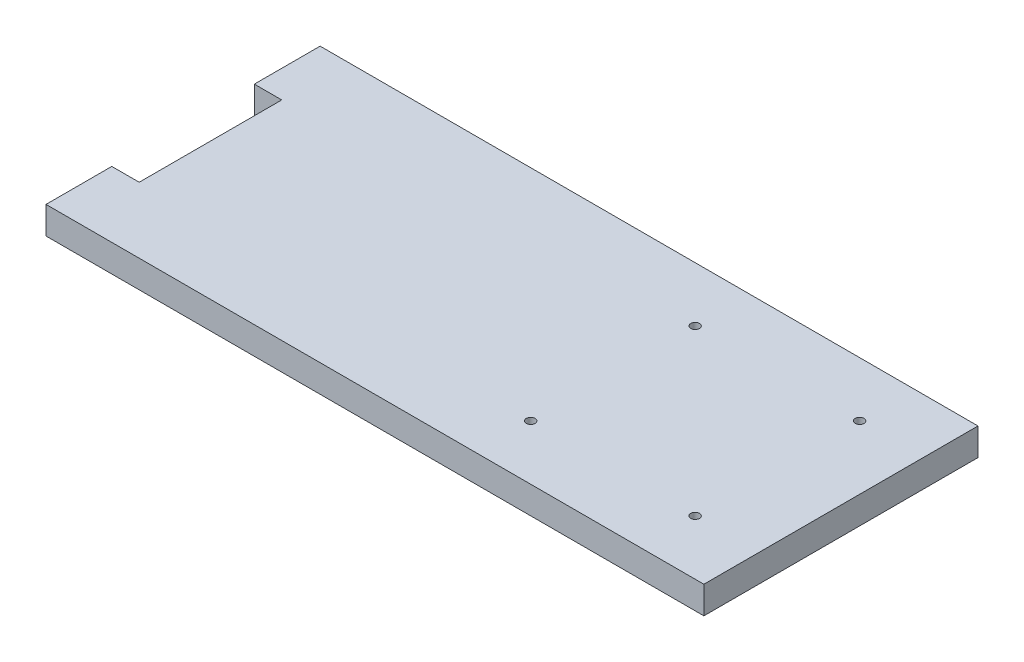
ISO-10303-21;
HEADER;
FILE_DESCRIPTION(('STEP AP214'),'2;1');
FILE_NAME('part.step','',(''),(''),'','','');
FILE_SCHEMA(('AUTOMOTIVE_DESIGN { 1 0 10303 214 1 1 1 1 }'));
ENDSEC;
DATA;
#1=APPLICATION_CONTEXT('core data for automotive mechanical design processes');
#2=APPLICATION_PROTOCOL_DEFINITION('international standard','automotive_design',2000,#1);
#3=PRODUCT_CONTEXT('',#1,'mechanical');
#4=PRODUCT('Part','Part','',(#3));
#5=PRODUCT_RELATED_PRODUCT_CATEGORY('part','',(#4));
#6=PRODUCT_DEFINITION_FORMATION('','',#4);
#7=PRODUCT_DEFINITION_CONTEXT('part definition',#1,'design');
#8=PRODUCT_DEFINITION('design','',#6,#7);
#9=PRODUCT_DEFINITION_SHAPE('','',#8);
#10=(LENGTH_UNIT() NAMED_UNIT(*) SI_UNIT(.MILLI.,.METRE.));
#11=(NAMED_UNIT(*) PLANE_ANGLE_UNIT() SI_UNIT($,.RADIAN.));
#12=(NAMED_UNIT(*) SI_UNIT($,.STERADIAN.) SOLID_ANGLE_UNIT());
#13=UNCERTAINTY_MEASURE_WITH_UNIT(LENGTH_MEASURE(1.E-05),#10,'distance_accuracy_value','');
#14=(GEOMETRIC_REPRESENTATION_CONTEXT(3) GLOBAL_UNCERTAINTY_ASSIGNED_CONTEXT((#13)) GLOBAL_UNIT_ASSIGNED_CONTEXT((#10,
#11,#12)) REPRESENTATION_CONTEXT('',''));
#15=CARTESIAN_POINT('',(0.,0.,0.));
#16=DIRECTION('',(0.,0.,1.));
#17=DIRECTION('',(1.,0.,0.));
#18=AXIS2_PLACEMENT_3D('',#15,#16,#17);
#19=CARTESIAN_POINT('',(-38.1,3.175,-15.875));
#20=DIRECTION('',(1.,0.,0.));
#21=DIRECTION('',(0.,0.,-1.));
#22=AXIS2_PLACEMENT_3D('',#19,#20,#21);
#23=PLANE('',#22);
#24=DIRECTION('',(0.,0.,1.));
#25=VECTOR('',#24,1.);
#26=CARTESIAN_POINT('',(-38.1,0.,-15.875));
#27=LINE('',#26,#25);
#28=CARTESIAN_POINT('',(-38.1,0.,-15.875));
#29=VERTEX_POINT('',#28);
#30=CARTESIAN_POINT('',(-38.1,0.,-8.255));
#31=VERTEX_POINT('',#30);
#32=EDGE_CURVE('E126',#29,#31,#27,.T.);
#33=ORIENTED_EDGE('',*,*,#32,.T.);
#34=DIRECTION('',(0.,1.,0.));
#35=VECTOR('',#34,1.);
#36=CARTESIAN_POINT('',(-38.1,0.,-8.255));
#37=LINE('',#36,#35);
#38=CARTESIAN_POINT('',(-38.1,3.175,-8.255));
#39=VERTEX_POINT('',#38);
#40=EDGE_CURVE('E159',#31,#39,#37,.T.);
#41=ORIENTED_EDGE('',*,*,#40,.T.);
#42=DIRECTION('',(0.,0.,1.));
#43=VECTOR('',#42,1.);
#44=CARTESIAN_POINT('',(-38.1,3.175,-15.875));
#45=LINE('',#44,#43);
#46=CARTESIAN_POINT('',(-38.1,3.175,-15.875));
#47=VERTEX_POINT('',#46);
#48=EDGE_CURVE('E145',#47,#39,#45,.T.);
#49=ORIENTED_EDGE('',*,*,#48,.F.);
#50=DIRECTION('',(0.,-1.,0.));
#51=VECTOR('',#50,1.);
#52=CARTESIAN_POINT('',(-38.1,3.175,-15.875));
#53=LINE('',#52,#51);
#54=EDGE_CURVE('E40',#47,#29,#53,.T.);
#55=ORIENTED_EDGE('',*,*,#54,.T.);
#56=EDGE_LOOP('',(#33,#41,#49,#55));
#57=FACE_BOUND('',#56,.T.);
#58=ADVANCED_FACE('F32',(#57),#23,.F.);
#59=CARTESIAN_POINT('',(38.1,3.175,-15.875));
#60=DIRECTION('',(-1.,0.,0.));
#61=DIRECTION('',(0.,0.,1.));
#62=AXIS2_PLACEMENT_3D('',#59,#60,#61);
#63=PLANE('',#62);
#64=DIRECTION('',(0.,0.,-1.));
#65=VECTOR('',#64,1.);
#66=CARTESIAN_POINT('',(38.1,0.,-15.875));
#67=LINE('',#66,#65);
#68=CARTESIAN_POINT('',(38.1,0.,15.875));
#69=VERTEX_POINT('',#68);
#70=CARTESIAN_POINT('',(38.1,0.,-15.875));
#71=VERTEX_POINT('',#70);
#72=EDGE_CURVE('E130',#69,#71,#67,.T.);
#73=ORIENTED_EDGE('',*,*,#72,.T.);
#74=DIRECTION('',(0.,-1.,0.));
#75=VECTOR('',#74,1.);
#76=CARTESIAN_POINT('',(38.1,3.175,-15.875));
#77=LINE('',#76,#75);
#78=CARTESIAN_POINT('',(38.1,3.175,-15.875));
#79=VERTEX_POINT('',#78);
#80=EDGE_CURVE('E11',#79,#71,#77,.T.);
#81=ORIENTED_EDGE('',*,*,#80,.F.);
#82=DIRECTION('',(0.,0.,-1.));
#83=VECTOR('',#82,1.);
#84=CARTESIAN_POINT('',(38.1,3.175,-15.875));
#85=LINE('',#84,#83);
#86=CARTESIAN_POINT('',(38.1,3.175,15.875));
#87=VERTEX_POINT('',#86);
#88=EDGE_CURVE('E135',#87,#79,#85,.T.);
#89=ORIENTED_EDGE('',*,*,#88,.F.);
#90=DIRECTION('',(0.,-1.,0.));
#91=VECTOR('',#90,1.);
#92=CARTESIAN_POINT('',(38.1,3.175,15.875));
#93=LINE('',#92,#91);
#94=EDGE_CURVE('E136',#87,#69,#93,.T.);
#95=ORIENTED_EDGE('',*,*,#94,.T.);
#96=EDGE_LOOP('',(#73,#81,#89,#95));
#97=FACE_BOUND('',#96,.T.);
#98=ADVANCED_FACE('F34',(#97),#63,.F.);
#99=CARTESIAN_POINT('',(-38.1,3.175,-15.875));
#100=DIRECTION('',(0.,0.,1.));
#101=DIRECTION('',(1.,0.,0.));
#102=AXIS2_PLACEMENT_3D('',#99,#100,#101);
#103=PLANE('',#102);
#104=DIRECTION('',(-1.,0.,0.));
#105=VECTOR('',#104,1.);
#106=CARTESIAN_POINT('',(-38.1,0.,-15.875));
#107=LINE('',#106,#105);
#108=EDGE_CURVE('E127',#71,#29,#107,.T.);
#109=ORIENTED_EDGE('',*,*,#108,.T.);
#110=ORIENTED_EDGE('',*,*,#54,.F.);
#111=DIRECTION('',(-1.,0.,0.));
#112=VECTOR('',#111,1.);
#113=CARTESIAN_POINT('',(-38.1,3.175,-15.875));
#114=LINE('',#113,#112);
#115=EDGE_CURVE('E84',#79,#47,#114,.T.);
#116=ORIENTED_EDGE('',*,*,#115,.F.);
#117=ORIENTED_EDGE('',*,*,#80,.T.);
#118=EDGE_LOOP('',(#109,#110,#116,#117));
#119=FACE_BOUND('',#118,.T.);
#120=ADVANCED_FACE('F181',(#119),#103,.F.);
#121=CARTESIAN_POINT('',(-38.1,3.175,8.25500000000001));
#122=VERTEX_POINT('',#121);
#123=CARTESIAN_POINT('',(-38.1,3.175,15.875));
#124=VERTEX_POINT('',#123);
#125=EDGE_CURVE('E121',#122,#124,#45,.T.);
#126=ORIENTED_EDGE('',*,*,#125,.F.);
#127=DIRECTION('',(0.,1.,0.));
#128=VECTOR('',#127,1.);
#129=CARTESIAN_POINT('',(-38.1,0.,8.25500000000001));
#130=LINE('',#129,#128);
#131=CARTESIAN_POINT('',(-38.1,0.,8.25500000000001));
#132=VERTEX_POINT('',#131);
#133=EDGE_CURVE('E109',#132,#122,#130,.T.);
#134=ORIENTED_EDGE('',*,*,#133,.F.);
#135=CARTESIAN_POINT('',(-38.1,0.,15.875));
#136=VERTEX_POINT('',#135);
#137=EDGE_CURVE('E120',#132,#136,#27,.T.);
#138=ORIENTED_EDGE('',*,*,#137,.T.);
#139=DIRECTION('',(0.,-1.,0.));
#140=VECTOR('',#139,1.);
#141=CARTESIAN_POINT('',(-38.1,3.175,15.875));
#142=LINE('',#141,#140);
#143=EDGE_CURVE('E138',#124,#136,#142,.T.);
#144=ORIENTED_EDGE('',*,*,#143,.F.);
#145=EDGE_LOOP('',(#126,#134,#138,#144));
#146=FACE_BOUND('',#145,.T.);
#147=ADVANCED_FACE('F118',(#146),#23,.F.);
#148=CARTESIAN_POINT('',(-38.1,3.175,15.875));
#149=DIRECTION('',(0.,0.,-1.));
#150=DIRECTION('',(-1.,0.,0.));
#151=AXIS2_PLACEMENT_3D('',#148,#149,#150);
#152=PLANE('',#151);
#153=DIRECTION('',(1.,0.,0.));
#154=VECTOR('',#153,1.);
#155=CARTESIAN_POINT('',(-38.1,0.,15.875));
#156=LINE('',#155,#154);
#157=EDGE_CURVE('E77',#136,#69,#156,.T.);
#158=ORIENTED_EDGE('',*,*,#157,.T.);
#159=ORIENTED_EDGE('',*,*,#94,.F.);
#160=DIRECTION('',(1.,0.,0.));
#161=VECTOR('',#160,1.);
#162=CARTESIAN_POINT('',(-38.1,3.175,15.875));
#163=LINE('',#162,#161);
#164=EDGE_CURVE('E56',#124,#87,#163,.T.);
#165=ORIENTED_EDGE('',*,*,#164,.F.);
#166=ORIENTED_EDGE('',*,*,#143,.T.);
#167=EDGE_LOOP('',(#158,#159,#165,#166));
#168=FACE_BOUND('',#167,.T.);
#169=ADVANCED_FACE('F171',(#168),#152,.F.);
#170=CARTESIAN_POINT('',(0.,3.175,0.));
#171=DIRECTION('',(0.,1.,0.));
#172=DIRECTION('',(0.,0.,1.));
#173=AXIS2_PLACEMENT_3D('',#170,#171,#172);
#174=PLANE('',#173);
#175=CARTESIAN_POINT('',(11.6870056405426,3.175,9.52500000000001));
#176=DIRECTION('',(0.,1.,0.));
#177=DIRECTION('',(0.,0.,1.));
#178=AXIS2_PLACEMENT_3D('',#175,#176,#177);
#179=CIRCLE('',#178,0.508000000000002);
#180=CARTESIAN_POINT('',(11.6870056405426,3.175,10.033));
#181=VERTEX_POINT('',#180);
#182=EDGE_CURVE('E290',#181,#181,#179,.T.);
#183=ORIENTED_EDGE('',*,*,#182,.F.);
#184=EDGE_LOOP('',(#183));
#185=FACE_BOUND('',#184,.T.);
#186=CARTESIAN_POINT('',(11.6870056405426,3.175,-9.52499999999999));
#187=DIRECTION('',(0.,1.,0.));
#188=DIRECTION('',(0.,0.,1.));
#189=AXIS2_PLACEMENT_3D('',#186,#187,#188);
#190=CIRCLE('',#189,0.508000000000002);
#191=CARTESIAN_POINT('',(11.6870056405426,3.175,-9.01699999999999));
#192=VERTEX_POINT('',#191);
#193=EDGE_CURVE('E292',#192,#192,#190,.T.);
#194=ORIENTED_EDGE('',*,*,#193,.F.);
#195=EDGE_LOOP('',(#194));
#196=FACE_BOUND('',#195,.T.);
#197=CARTESIAN_POINT('',(30.7370056405426,3.175,9.525));
#198=DIRECTION('',(0.,1.,0.));
#199=DIRECTION('',(0.,0.,1.));
#200=AXIS2_PLACEMENT_3D('',#197,#198,#199);
#201=CIRCLE('',#200,0.508000000000002);
#202=CARTESIAN_POINT('',(30.7370056405426,3.175,10.033));
#203=VERTEX_POINT('',#202);
#204=EDGE_CURVE('E298',#203,#203,#201,.T.);
#205=ORIENTED_EDGE('',*,*,#204,.F.);
#206=EDGE_LOOP('',(#205));
#207=FACE_BOUND('',#206,.T.);
#208=CARTESIAN_POINT('',(30.7370056405426,3.175,-9.525));
#209=DIRECTION('',(0.,1.,0.));
#210=DIRECTION('',(0.,0.,1.));
#211=AXIS2_PLACEMENT_3D('',#208,#209,#210);
#212=CIRCLE('',#211,0.508000000000002);
#213=CARTESIAN_POINT('',(30.7370056405426,3.175,-9.017));
#214=VERTEX_POINT('',#213);
#215=EDGE_CURVE('E304',#214,#214,#212,.T.);
#216=ORIENTED_EDGE('',*,*,#215,.F.);
#217=EDGE_LOOP('',(#216));
#218=FACE_BOUND('',#217,.T.);
#219=DIRECTION('',(-1.,0.,0.));
#220=VECTOR('',#219,1.);
#221=CARTESIAN_POINT('',(-38.1,3.175,-8.255));
#222=LINE('',#221,#220);
#223=CARTESIAN_POINT('',(-34.925,3.175,-8.255));
#224=VERTEX_POINT('',#223);
#225=EDGE_CURVE('E114',#224,#39,#222,.T.);
#226=ORIENTED_EDGE('',*,*,#225,.F.);
#227=DIRECTION('',(0.,0.,-1.));
#228=VECTOR('',#227,1.);
#229=CARTESIAN_POINT('',(-34.925,3.175,-8.255));
#230=LINE('',#229,#228);
#231=CARTESIAN_POINT('',(-34.925,3.175,8.25500000000001));
#232=VERTEX_POINT('',#231);
#233=EDGE_CURVE('E154',#232,#224,#230,.T.);
#234=ORIENTED_EDGE('',*,*,#233,.F.);
#235=DIRECTION('',(1.,0.,0.));
#236=VECTOR('',#235,1.);
#237=CARTESIAN_POINT('',(-38.1,3.175,8.25500000000001));
#238=LINE('',#237,#236);
#239=EDGE_CURVE('E152',#122,#232,#238,.T.);
#240=ORIENTED_EDGE('',*,*,#239,.F.);
#241=ORIENTED_EDGE('',*,*,#125,.T.);
#242=ORIENTED_EDGE('',*,*,#164,.T.);
#243=ORIENTED_EDGE('',*,*,#88,.T.);
#244=ORIENTED_EDGE('',*,*,#115,.T.);
#245=ORIENTED_EDGE('',*,*,#48,.T.);
#246=EDGE_LOOP('',(#226,#234,#240,#241,#242,#243,#244,#245));
#247=FACE_BOUND('',#246,.T.);
#248=ADVANCED_FACE('F173',(#185,#196,#207,#218,#247),#174,.T.);
#249=CARTESIAN_POINT('',(0.,0.,0.));
#250=DIRECTION('',(0.,1.,0.));
#251=DIRECTION('',(0.,0.,1.));
#252=AXIS2_PLACEMENT_3D('',#249,#250,#251);
#253=PLANE('',#252);
#254=CARTESIAN_POINT('',(11.6870056405426,0.,9.52500000000001));
#255=DIRECTION('',(0.,1.,0.));
#256=DIRECTION('',(0.,0.,1.));
#257=AXIS2_PLACEMENT_3D('',#254,#255,#256);
#258=CIRCLE('',#257,0.508000000000002);
#259=CARTESIAN_POINT('',(11.6870056405426,0.,10.033));
#260=VERTEX_POINT('',#259);
#261=EDGE_CURVE('E287',#260,#260,#258,.T.);
#262=ORIENTED_EDGE('',*,*,#261,.T.);
#263=EDGE_LOOP('',(#262));
#264=FACE_BOUND('',#263,.T.);
#265=CARTESIAN_POINT('',(11.6870056405426,0.,-9.52499999999999));
#266=DIRECTION('',(0.,1.,0.));
#267=DIRECTION('',(0.,0.,1.));
#268=AXIS2_PLACEMENT_3D('',#265,#266,#267);
#269=CIRCLE('',#268,0.508000000000002);
#270=CARTESIAN_POINT('',(11.6870056405426,0.,-9.01699999999999));
#271=VERTEX_POINT('',#270);
#272=EDGE_CURVE('E295',#271,#271,#269,.T.);
#273=ORIENTED_EDGE('',*,*,#272,.T.);
#274=EDGE_LOOP('',(#273));
#275=FACE_BOUND('',#274,.T.);
#276=CARTESIAN_POINT('',(30.7370056405426,0.,9.525));
#277=DIRECTION('',(0.,1.,0.));
#278=DIRECTION('',(0.,0.,1.));
#279=AXIS2_PLACEMENT_3D('',#276,#277,#278);
#280=CIRCLE('',#279,0.508000000000002);
#281=CARTESIAN_POINT('',(30.7370056405426,0.,10.033));
#282=VERTEX_POINT('',#281);
#283=EDGE_CURVE('E301',#282,#282,#280,.T.);
#284=ORIENTED_EDGE('',*,*,#283,.T.);
#285=EDGE_LOOP('',(#284));
#286=FACE_BOUND('',#285,.T.);
#287=CARTESIAN_POINT('',(30.7370056405426,0.,-9.525));
#288=DIRECTION('',(0.,1.,0.));
#289=DIRECTION('',(0.,0.,1.));
#290=AXIS2_PLACEMENT_3D('',#287,#288,#289);
#291=CIRCLE('',#290,0.508000000000002);
#292=CARTESIAN_POINT('',(30.7370056405426,0.,-9.017));
#293=VERTEX_POINT('',#292);
#294=EDGE_CURVE('E155',#293,#293,#291,.T.);
#295=ORIENTED_EDGE('',*,*,#294,.T.);
#296=EDGE_LOOP('',(#295));
#297=FACE_BOUND('',#296,.T.);
#298=DIRECTION('',(0.,0.,-1.));
#299=VECTOR('',#298,1.);
#300=CARTESIAN_POINT('',(-34.925,0.,-8.255));
#301=LINE('',#300,#299);
#302=CARTESIAN_POINT('',(-34.925,0.,8.25500000000001));
#303=VERTEX_POINT('',#302);
#304=CARTESIAN_POINT('',(-34.925,0.,-8.255));
#305=VERTEX_POINT('',#304);
#306=EDGE_CURVE('E47',#303,#305,#301,.T.);
#307=ORIENTED_EDGE('',*,*,#306,.T.);
#308=DIRECTION('',(-1.,0.,0.));
#309=VECTOR('',#308,1.);
#310=CARTESIAN_POINT('',(-38.1,0.,-8.255));
#311=LINE('',#310,#309);
#312=EDGE_CURVE('E122',#305,#31,#311,.T.);
#313=ORIENTED_EDGE('',*,*,#312,.T.);
#314=ORIENTED_EDGE('',*,*,#32,.F.);
#315=ORIENTED_EDGE('',*,*,#108,.F.);
#316=ORIENTED_EDGE('',*,*,#72,.F.);
#317=ORIENTED_EDGE('',*,*,#157,.F.);
#318=ORIENTED_EDGE('',*,*,#137,.F.);
#319=DIRECTION('',(1.,0.,0.));
#320=VECTOR('',#319,1.);
#321=CARTESIAN_POINT('',(-38.1,0.,8.25500000000001));
#322=LINE('',#321,#320);
#323=EDGE_CURVE('E105',#132,#303,#322,.T.);
#324=ORIENTED_EDGE('',*,*,#323,.T.);
#325=EDGE_LOOP('',(#307,#313,#314,#315,#316,#317,#318,#324));
#326=FACE_BOUND('',#325,.T.);
#327=ADVANCED_FACE('F124',(#264,#275,#286,#297,#326),#253,.F.);
#328=CARTESIAN_POINT('',(-38.1,0.,-8.255));
#329=DIRECTION('',(0.,0.,-1.));
#330=DIRECTION('',(-1.,0.,0.));
#331=AXIS2_PLACEMENT_3D('',#328,#329,#330);
#332=PLANE('',#331);
#333=ORIENTED_EDGE('',*,*,#225,.T.);
#334=ORIENTED_EDGE('',*,*,#40,.F.);
#335=ORIENTED_EDGE('',*,*,#312,.F.);
#336=DIRECTION('',(0.,1.,0.));
#337=VECTOR('',#336,1.);
#338=CARTESIAN_POINT('',(-34.925,0.,-8.255));
#339=LINE('',#338,#337);
#340=EDGE_CURVE('E161',#305,#224,#339,.T.);
#341=ORIENTED_EDGE('',*,*,#340,.T.);
#342=EDGE_LOOP('',(#333,#334,#335,#341));
#343=FACE_BOUND('',#342,.T.);
#344=ADVANCED_FACE('F215',(#343),#332,.F.);
#345=CARTESIAN_POINT('',(-34.925,0.,-8.255));
#346=DIRECTION('',(1.,0.,0.));
#347=DIRECTION('',(0.,0.,-1.));
#348=AXIS2_PLACEMENT_3D('',#345,#346,#347);
#349=PLANE('',#348);
#350=ORIENTED_EDGE('',*,*,#233,.T.);
#351=ORIENTED_EDGE('',*,*,#340,.F.);
#352=ORIENTED_EDGE('',*,*,#306,.F.);
#353=DIRECTION('',(0.,1.,0.));
#354=VECTOR('',#353,1.);
#355=CARTESIAN_POINT('',(-34.925,0.,8.25500000000001));
#356=LINE('',#355,#354);
#357=EDGE_CURVE('E111',#303,#232,#356,.T.);
#358=ORIENTED_EDGE('',*,*,#357,.T.);
#359=EDGE_LOOP('',(#350,#351,#352,#358));
#360=FACE_BOUND('',#359,.T.);
#361=ADVANCED_FACE('F224',(#360),#349,.F.);
#362=CARTESIAN_POINT('',(-38.1,0.,8.25500000000001));
#363=DIRECTION('',(0.,0.,1.));
#364=DIRECTION('',(1.,0.,0.));
#365=AXIS2_PLACEMENT_3D('',#362,#363,#364);
#366=PLANE('',#365);
#367=ORIENTED_EDGE('',*,*,#239,.T.);
#368=ORIENTED_EDGE('',*,*,#357,.F.);
#369=ORIENTED_EDGE('',*,*,#323,.F.);
#370=ORIENTED_EDGE('',*,*,#133,.T.);
#371=EDGE_LOOP('',(#367,#368,#369,#370));
#372=FACE_BOUND('',#371,.T.);
#373=ADVANCED_FACE('F108',(#372),#366,.F.);
#374=CARTESIAN_POINT('',(30.7370056405426,0.,-9.525));
#375=DIRECTION('',(0.,1.,0.));
#376=DIRECTION('',(0.,0.,1.));
#377=AXIS2_PLACEMENT_3D('',#374,#375,#376);
#378=CYLINDRICAL_SURFACE('',#377,0.508000000000002);
#379=ORIENTED_EDGE('',*,*,#294,.F.);
#380=EDGE_LOOP('',(#379));
#381=FACE_BOUND('',#380,.T.);
#382=ORIENTED_EDGE('',*,*,#215,.T.);
#383=EDGE_LOOP('',(#382));
#384=FACE_BOUND('',#383,.T.);
#385=ADVANCED_FACE('F241',(#381,#384),#378,.F.);
#386=CARTESIAN_POINT('',(30.7370056405426,0.,9.525));
#387=DIRECTION('',(0.,1.,0.));
#388=DIRECTION('',(0.,0.,1.));
#389=AXIS2_PLACEMENT_3D('',#386,#387,#388);
#390=CYLINDRICAL_SURFACE('',#389,0.508000000000002);
#391=ORIENTED_EDGE('',*,*,#283,.F.);
#392=EDGE_LOOP('',(#391));
#393=FACE_BOUND('',#392,.T.);
#394=ORIENTED_EDGE('',*,*,#204,.T.);
#395=EDGE_LOOP('',(#394));
#396=FACE_BOUND('',#395,.T.);
#397=ADVANCED_FACE('F250',(#393,#396),#390,.F.);
#398=CARTESIAN_POINT('',(11.6870056405426,0.,-9.52499999999999));
#399=DIRECTION('',(0.,1.,0.));
#400=DIRECTION('',(0.,0.,1.));
#401=AXIS2_PLACEMENT_3D('',#398,#399,#400);
#402=CYLINDRICAL_SURFACE('',#401,0.508000000000002);
#403=ORIENTED_EDGE('',*,*,#272,.F.);
#404=EDGE_LOOP('',(#403));
#405=FACE_BOUND('',#404,.T.);
#406=ORIENTED_EDGE('',*,*,#193,.T.);
#407=EDGE_LOOP('',(#406));
#408=FACE_BOUND('',#407,.T.);
#409=ADVANCED_FACE('F260',(#405,#408),#402,.F.);
#410=CARTESIAN_POINT('',(11.6870056405426,0.,9.52500000000001));
#411=DIRECTION('',(0.,1.,0.));
#412=DIRECTION('',(0.,0.,1.));
#413=AXIS2_PLACEMENT_3D('',#410,#411,#412);
#414=CYLINDRICAL_SURFACE('',#413,0.508000000000002);
#415=ORIENTED_EDGE('',*,*,#261,.F.);
#416=EDGE_LOOP('',(#415));
#417=FACE_BOUND('',#416,.T.);
#418=ORIENTED_EDGE('',*,*,#182,.T.);
#419=EDGE_LOOP('',(#418));
#420=FACE_BOUND('',#419,.T.);
#421=ADVANCED_FACE('F270',(#417,#420),#414,.F.);
#422=CLOSED_SHELL('',(#58,#98,#120,#147,#169,#248,#327,#344,#361,#373,#385,#397,#409,#421));
#423=MANIFOLD_SOLID_BREP('B2',#422);
#424=ADVANCED_BREP_SHAPE_REPRESENTATION('',(#18,#423),#14);
#425=SHAPE_DEFINITION_REPRESENTATION(#9,#424);
ENDSEC;
END-ISO-10303-21;
